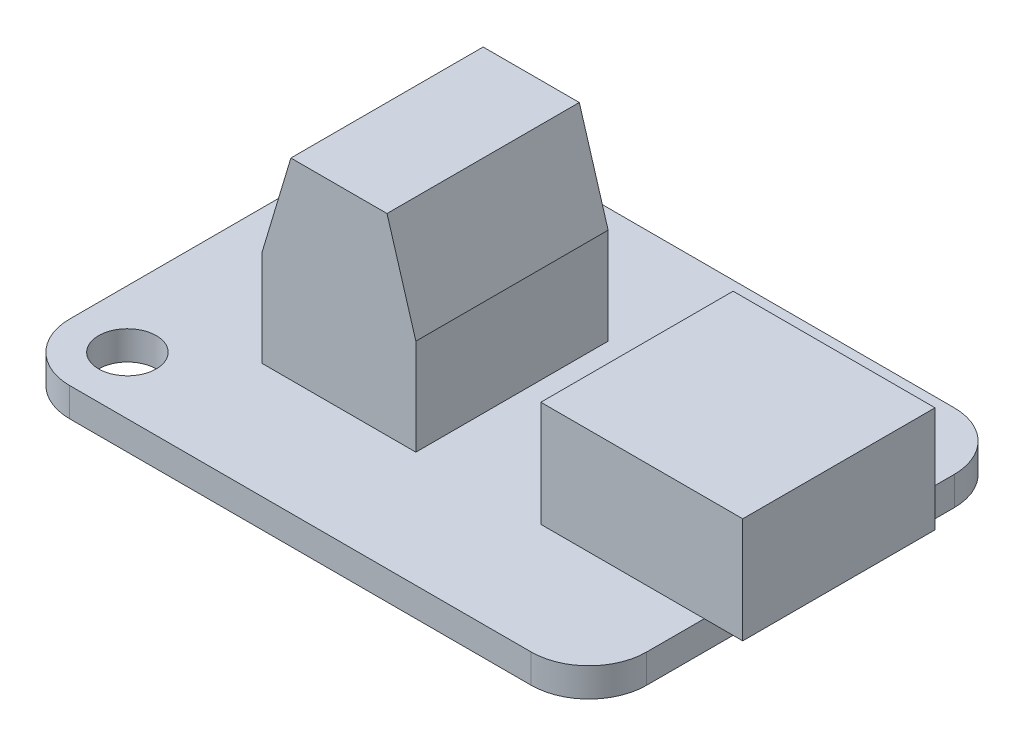
ISO-10303-21;
HEADER;
FILE_DESCRIPTION(('STEP AP214'),'2;1');
FILE_NAME('part.step','',(''),(''),'','','');
FILE_SCHEMA(('AUTOMOTIVE_DESIGN { 1 0 10303 214 1 1 1 1 }'));
ENDSEC;
DATA;
#1=APPLICATION_CONTEXT('core data for automotive mechanical design processes');
#2=APPLICATION_PROTOCOL_DEFINITION('international standard','automotive_design',2000,#1);
#3=PRODUCT_CONTEXT('',#1,'mechanical');
#4=PRODUCT('Part','Part','',(#3));
#5=PRODUCT_RELATED_PRODUCT_CATEGORY('part','',(#4));
#6=PRODUCT_DEFINITION_FORMATION('','',#4);
#7=PRODUCT_DEFINITION_CONTEXT('part definition',#1,'design');
#8=PRODUCT_DEFINITION('design','',#6,#7);
#9=PRODUCT_DEFINITION_SHAPE('','',#8);
#10=(LENGTH_UNIT() NAMED_UNIT(*) SI_UNIT(.MILLI.,.METRE.));
#11=(NAMED_UNIT(*) PLANE_ANGLE_UNIT() SI_UNIT($,.RADIAN.));
#12=(NAMED_UNIT(*) SI_UNIT($,.STERADIAN.) SOLID_ANGLE_UNIT());
#13=UNCERTAINTY_MEASURE_WITH_UNIT(LENGTH_MEASURE(1.E-05),#10,'distance_accuracy_value','');
#14=(GEOMETRIC_REPRESENTATION_CONTEXT(3) GLOBAL_UNCERTAINTY_ASSIGNED_CONTEXT((#13)) GLOBAL_UNIT_ASSIGNED_CONTEXT((#10,
#11,#12)) REPRESENTATION_CONTEXT('',''));
#15=CARTESIAN_POINT('',(0.,0.,0.));
#16=DIRECTION('',(0.,0.,1.));
#17=DIRECTION('',(1.,0.,0.));
#18=AXIS2_PLACEMENT_3D('',#15,#16,#17);
#19=CARTESIAN_POINT('',(-1.19831368631368,1.5,13.1654125874126));
#20=DIRECTION('',(0.,-1.,0.));
#21=DIRECTION('',(0.,0.,-1.));
#22=AXIS2_PLACEMENT_3D('',#19,#20,#21);
#23=PLANE('',#22);
#24=DIRECTION('',(-1.,0.,0.));
#25=VECTOR('',#24,1.);
#26=CARTESIAN_POINT('',(1.80168631368632,1.5,0.165412587412595));
#27=LINE('',#26,#25);
#28=CARTESIAN_POINT('',(1.80168631368632,1.5,0.165412587412596));
#29=VERTEX_POINT('',#28);
#30=CARTESIAN_POINT('',(-6.69831368631368,1.5,0.165412587412596));
#31=VERTEX_POINT('',#30);
#32=EDGE_CURVE('E11',#29,#31,#27,.T.);
#33=ORIENTED_EDGE('',*,*,#32,.F.);
#34=DIRECTION('',(0.,0.,-1.));
#35=VECTOR('',#34,1.);
#36=CARTESIAN_POINT('',(1.80168631368632,1.5,-2.83458741258738));
#37=LINE('',#36,#35);
#38=CARTESIAN_POINT('',(1.80168631368632,1.5,-2.83458741258738));
#39=VERTEX_POINT('',#38);
#40=EDGE_CURVE('E259',#29,#39,#37,.T.);
#41=ORIENTED_EDGE('',*,*,#40,.T.);
#42=CARTESIAN_POINT('',(-1.19831368631368,1.5,-2.8345874125874));
#43=DIRECTION('',(0.,1.,0.));
#44=DIRECTION('',(0.,0.,1.));
#45=AXIS2_PLACEMENT_3D('',#42,#43,#44);
#46=CIRCLE('',#45,3.);
#47=CARTESIAN_POINT('',(-1.1983136863137,1.5,-5.8345874125874));
#48=VERTEX_POINT('',#47);
#49=EDGE_CURVE('E264',#39,#48,#46,.T.);
#50=ORIENTED_EDGE('',*,*,#49,.T.);
#51=DIRECTION('',(-1.,0.,0.));
#52=VECTOR('',#51,1.);
#53=CARTESIAN_POINT('',(-25.1983136863137,1.5,-5.8345874125874));
#54=LINE('',#53,#52);
#55=CARTESIAN_POINT('',(-25.1983136863137,1.5,-5.8345874125874));
#56=VERTEX_POINT('',#55);
#57=EDGE_CURVE('E267',#48,#56,#54,.T.);
#58=ORIENTED_EDGE('',*,*,#57,.T.);
#59=CARTESIAN_POINT('',(-25.1983136863137,1.5,-2.8345874125874));
#60=DIRECTION('',(0.,1.,0.));
#61=DIRECTION('',(0.,0.,1.));
#62=AXIS2_PLACEMENT_3D('',#59,#60,#61);
#63=CIRCLE('',#62,3.);
#64=CARTESIAN_POINT('',(-28.1983136863137,1.5,-2.83458741258738));
#65=VERTEX_POINT('',#64);
#66=EDGE_CURVE('E269',#56,#65,#63,.T.);
#67=ORIENTED_EDGE('',*,*,#66,.T.);
#68=DIRECTION('',(0.,0.,1.));
#69=VECTOR('',#68,1.);
#70=CARTESIAN_POINT('',(-28.1983136863137,1.5,-2.83458741258738));
#71=LINE('',#70,#69);
#72=CARTESIAN_POINT('',(-28.1983136863137,1.5,13.1654125874126));
#73=VERTEX_POINT('',#72);
#74=EDGE_CURVE('E271',#65,#73,#71,.T.);
#75=ORIENTED_EDGE('',*,*,#74,.T.);
#76=CARTESIAN_POINT('',(-25.1983136863137,1.5,13.1654125874126));
#77=DIRECTION('',(0.,1.,0.));
#78=DIRECTION('',(0.,0.,-1.));
#79=AXIS2_PLACEMENT_3D('',#76,#77,#78);
#80=CIRCLE('',#79,3.);
#81=CARTESIAN_POINT('',(-25.1983136863137,1.5,16.1654125874126));
#82=VERTEX_POINT('',#81);
#83=EDGE_CURVE('E273',#73,#82,#80,.T.);
#84=ORIENTED_EDGE('',*,*,#83,.T.);
#85=DIRECTION('',(1.,0.,0.));
#86=VECTOR('',#85,1.);
#87=CARTESIAN_POINT('',(-1.1983136863137,1.5,16.1654125874126));
#88=LINE('',#87,#86);
#89=CARTESIAN_POINT('',(-1.1983136863137,1.5,16.1654125874126));
#90=VERTEX_POINT('',#89);
#91=EDGE_CURVE('E275',#82,#90,#88,.T.);
#92=ORIENTED_EDGE('',*,*,#91,.T.);
#93=CARTESIAN_POINT('',(-1.19831368631368,1.5,13.1654125874126));
#94=DIRECTION('',(0.,1.,0.));
#95=DIRECTION('',(0.,0.,-1.));
#96=AXIS2_PLACEMENT_3D('',#93,#94,#95);
#97=CIRCLE('',#96,3.);
#98=CARTESIAN_POINT('',(1.80168631368632,1.5,13.1654125874126));
#99=VERTEX_POINT('',#98);
#100=EDGE_CURVE('E256',#90,#99,#97,.T.);
#101=ORIENTED_EDGE('',*,*,#100,.T.);
#102=CARTESIAN_POINT('',(1.80168631368632,1.5,10.1654125874126));
#103=VERTEX_POINT('',#102);
#104=EDGE_CURVE('E261',#99,#103,#37,.T.);
#105=ORIENTED_EDGE('',*,*,#104,.T.);
#106=DIRECTION('',(1.,0.,0.));
#107=VECTOR('',#106,1.);
#108=CARTESIAN_POINT('',(1.80168631368632,1.5,10.1654125874126));
#109=LINE('',#108,#107);
#110=CARTESIAN_POINT('',(-6.69831368631368,1.5,10.1654125874126));
#111=VERTEX_POINT('',#110);
#112=EDGE_CURVE('E227',#111,#103,#109,.T.);
#113=ORIENTED_EDGE('',*,*,#112,.F.);
#114=DIRECTION('',(0.,0.,1.));
#115=VECTOR('',#114,1.);
#116=CARTESIAN_POINT('',(-6.69831368631368,1.5,0.165412587412596));
#117=LINE('',#116,#115);
#118=EDGE_CURVE('E223',#31,#111,#117,.T.);
#119=ORIENTED_EDGE('',*,*,#118,.F.);
#120=EDGE_LOOP('',(#33,#41,#50,#58,#67,#75,#84,#92,#101,#105,#113,#119));
#121=FACE_BOUND('',#120,.T.);
#122=CARTESIAN_POINT('',(-25.1983136863137,1.5,13.1654125874126));
#123=DIRECTION('',(0.,1.,0.));
#124=DIRECTION('',(0.,0.,1.));
#125=AXIS2_PLACEMENT_3D('',#122,#123,#124);
#126=CIRCLE('',#125,1.5);
#127=CARTESIAN_POINT('',(-25.1983136863137,1.5,14.6654125874126));
#128=VERTEX_POINT('',#127);
#129=EDGE_CURVE('E250',#128,#128,#126,.T.);
#130=ORIENTED_EDGE('',*,*,#129,.F.);
#131=EDGE_LOOP('',(#130));
#132=FACE_BOUND('',#131,.T.);
#133=CARTESIAN_POINT('',(-25.1983136863137,1.5,-2.8345874125874));
#134=DIRECTION('',(0.,1.,0.));
#135=DIRECTION('',(0.,0.,1.));
#136=AXIS2_PLACEMENT_3D('',#133,#134,#135);
#137=CIRCLE('',#136,1.5);
#138=CARTESIAN_POINT('',(-25.1983136863137,1.5,-1.3345874125874));
#139=VERTEX_POINT('',#138);
#140=EDGE_CURVE('E244',#139,#139,#137,.T.);
#141=ORIENTED_EDGE('',*,*,#140,.F.);
#142=EDGE_LOOP('',(#141));
#143=FACE_BOUND('',#142,.T.);
#144=DIRECTION('',(-1.,0.,0.));
#145=VECTOR('',#144,1.);
#146=CARTESIAN_POINT('',(-13.1983136863137,1.5,0.165412587412596));
#147=LINE('',#146,#145);
#148=CARTESIAN_POINT('',(-13.1983136863137,1.5,0.165412587412596));
#149=VERTEX_POINT('',#148);
#150=CARTESIAN_POINT('',(-21.1983136863137,1.5,0.165412587412596));
#151=VERTEX_POINT('',#150);
#152=EDGE_CURVE('E200',#149,#151,#147,.T.);
#153=ORIENTED_EDGE('',*,*,#152,.F.);
#154=DIRECTION('',(0.,0.,-1.));
#155=VECTOR('',#154,1.);
#156=CARTESIAN_POINT('',(-13.1983136863137,1.5,10.1654125874126));
#157=LINE('',#156,#155);
#158=CARTESIAN_POINT('',(-13.1983136863137,1.5,10.1654125874126));
#159=VERTEX_POINT('',#158);
#160=EDGE_CURVE('E176',#159,#149,#157,.T.);
#161=ORIENTED_EDGE('',*,*,#160,.F.);
#162=DIRECTION('',(1.,0.,0.));
#163=VECTOR('',#162,1.);
#164=CARTESIAN_POINT('',(-21.1983136863137,1.5,10.1654125874126));
#165=LINE('',#164,#163);
#166=CARTESIAN_POINT('',(-21.1983136863137,1.5,10.1654125874126));
#167=VERTEX_POINT('',#166);
#168=EDGE_CURVE('E59',#167,#159,#165,.T.);
#169=ORIENTED_EDGE('',*,*,#168,.F.);
#170=DIRECTION('',(0.,0.,1.));
#171=VECTOR('',#170,1.);
#172=CARTESIAN_POINT('',(-21.1983136863137,1.5,0.165412587412596));
#173=LINE('',#172,#171);
#174=EDGE_CURVE('E54',#151,#167,#173,.T.);
#175=ORIENTED_EDGE('',*,*,#174,.F.);
#176=EDGE_LOOP('',(#153,#161,#169,#175));
#177=FACE_BOUND('',#176,.T.);
#178=ADVANCED_FACE('F37',(#121,#132,#143,#177),#23,.F.);
#179=CARTESIAN_POINT('',(-1.19831368631368,0.,13.1654125874126));
#180=DIRECTION('',(0.,-1.,0.));
#181=DIRECTION('',(0.,0.,-1.));
#182=AXIS2_PLACEMENT_3D('',#179,#180,#181);
#183=PLANE('',#182);
#184=CARTESIAN_POINT('',(-25.1983136863137,0.,13.1654125874126));
#185=DIRECTION('',(0.,1.,0.));
#186=DIRECTION('',(0.,0.,1.));
#187=AXIS2_PLACEMENT_3D('',#184,#185,#186);
#188=CIRCLE('',#187,1.5);
#189=CARTESIAN_POINT('',(-25.1983136863137,0.,14.6654125874126));
#190=VERTEX_POINT('',#189);
#191=EDGE_CURVE('E247',#190,#190,#188,.T.);
#192=ORIENTED_EDGE('',*,*,#191,.T.);
#193=EDGE_LOOP('',(#192));
#194=FACE_BOUND('',#193,.T.);
#195=CARTESIAN_POINT('',(-1.19831368631368,0.,13.1654125874126));
#196=DIRECTION('',(0.,1.,0.));
#197=DIRECTION('',(0.,0.,-1.));
#198=AXIS2_PLACEMENT_3D('',#195,#196,#197);
#199=CIRCLE('',#198,3.);
#200=CARTESIAN_POINT('',(-1.1983136863137,0.,16.1654125874126));
#201=VERTEX_POINT('',#200);
#202=CARTESIAN_POINT('',(1.80168631368632,0.,13.1654125874126));
#203=VERTEX_POINT('',#202);
#204=EDGE_CURVE('E253',#201,#203,#199,.T.);
#205=ORIENTED_EDGE('',*,*,#204,.F.);
#206=DIRECTION('',(1.,0.,0.));
#207=VECTOR('',#206,1.);
#208=CARTESIAN_POINT('',(-1.1983136863137,0.,16.1654125874126));
#209=LINE('',#208,#207);
#210=CARTESIAN_POINT('',(-25.1983136863137,0.,16.1654125874126));
#211=VERTEX_POINT('',#210);
#212=EDGE_CURVE('E260',#211,#201,#209,.T.);
#213=ORIENTED_EDGE('',*,*,#212,.F.);
#214=CARTESIAN_POINT('',(-25.1983136863137,0.,13.1654125874126));
#215=DIRECTION('',(0.,1.,0.));
#216=DIRECTION('',(0.,0.,-1.));
#217=AXIS2_PLACEMENT_3D('',#214,#215,#216);
#218=CIRCLE('',#217,3.);
#219=CARTESIAN_POINT('',(-28.1983136863137,0.,13.1654125874126));
#220=VERTEX_POINT('',#219);
#221=EDGE_CURVE('E290',#220,#211,#218,.T.);
#222=ORIENTED_EDGE('',*,*,#221,.F.);
#223=DIRECTION('',(0.,0.,1.));
#224=VECTOR('',#223,1.);
#225=CARTESIAN_POINT('',(-28.1983136863137,0.,-2.83458741258738));
#226=LINE('',#225,#224);
#227=CARTESIAN_POINT('',(-28.1983136863137,0.,-2.83458741258738));
#228=VERTEX_POINT('',#227);
#229=EDGE_CURVE('E288',#228,#220,#226,.T.);
#230=ORIENTED_EDGE('',*,*,#229,.F.);
#231=CARTESIAN_POINT('',(-25.1983136863137,0.,-2.8345874125874));
#232=DIRECTION('',(0.,1.,0.));
#233=DIRECTION('',(0.,0.,1.));
#234=AXIS2_PLACEMENT_3D('',#231,#232,#233);
#235=CIRCLE('',#234,3.);
#236=CARTESIAN_POINT('',(-25.1983136863137,0.,-5.8345874125874));
#237=VERTEX_POINT('',#236);
#238=EDGE_CURVE('E286',#237,#228,#235,.T.);
#239=ORIENTED_EDGE('',*,*,#238,.F.);
#240=DIRECTION('',(-1.,0.,0.));
#241=VECTOR('',#240,1.);
#242=CARTESIAN_POINT('',(-25.1983136863137,0.,-5.8345874125874));
#243=LINE('',#242,#241);
#244=CARTESIAN_POINT('',(-1.1983136863137,0.,-5.8345874125874));
#245=VERTEX_POINT('',#244);
#246=EDGE_CURVE('E284',#245,#237,#243,.T.);
#247=ORIENTED_EDGE('',*,*,#246,.F.);
#248=CARTESIAN_POINT('',(-1.19831368631368,0.,-2.8345874125874));
#249=DIRECTION('',(0.,1.,0.));
#250=DIRECTION('',(0.,0.,1.));
#251=AXIS2_PLACEMENT_3D('',#248,#249,#250);
#252=CIRCLE('',#251,3.);
#253=CARTESIAN_POINT('',(1.80168631368632,0.,-2.83458741258738));
#254=VERTEX_POINT('',#253);
#255=EDGE_CURVE('E282',#254,#245,#252,.T.);
#256=ORIENTED_EDGE('',*,*,#255,.F.);
#257=DIRECTION('',(0.,0.,-1.));
#258=VECTOR('',#257,1.);
#259=CARTESIAN_POINT('',(1.80168631368632,0.,-2.83458741258738));
#260=LINE('',#259,#258);
#261=EDGE_CURVE('E280',#203,#254,#260,.T.);
#262=ORIENTED_EDGE('',*,*,#261,.F.);
#263=EDGE_LOOP('',(#205,#213,#222,#230,#239,#247,#256,#262));
#264=FACE_BOUND('',#263,.T.);
#265=CARTESIAN_POINT('',(-25.1983136863137,0.,-2.8345874125874));
#266=DIRECTION('',(0.,1.,0.));
#267=DIRECTION('',(0.,0.,1.));
#268=AXIS2_PLACEMENT_3D('',#265,#266,#267);
#269=CIRCLE('',#268,1.5);
#270=CARTESIAN_POINT('',(-25.1983136863137,0.,-1.3345874125874));
#271=VERTEX_POINT('',#270);
#272=EDGE_CURVE('E243',#271,#271,#269,.T.);
#273=ORIENTED_EDGE('',*,*,#272,.T.);
#274=EDGE_LOOP('',(#273));
#275=FACE_BOUND('',#274,.T.);
#276=ADVANCED_FACE('F325',(#194,#264,#275),#183,.T.);
#277=CARTESIAN_POINT('',(-1.19831368631368,1.5,13.1654125874126));
#278=DIRECTION('',(0.,-1.,0.));
#279=DIRECTION('',(0.,0.,-1.));
#280=AXIS2_PLACEMENT_3D('',#277,#278,#279);
#281=CYLINDRICAL_SURFACE('',#280,3.);
#282=ORIENTED_EDGE('',*,*,#204,.T.);
#283=DIRECTION('',(0.,-1.,0.));
#284=VECTOR('',#283,1.);
#285=CARTESIAN_POINT('',(1.80168631368632,1.5,13.1654125874126));
#286=LINE('',#285,#284);
#287=EDGE_CURVE('E41',#99,#203,#286,.T.);
#288=ORIENTED_EDGE('',*,*,#287,.F.);
#289=ORIENTED_EDGE('',*,*,#100,.F.);
#290=DIRECTION('',(0.,-1.,0.));
#291=VECTOR('',#290,1.);
#292=CARTESIAN_POINT('',(-1.1983136863137,1.5,16.1654125874126));
#293=LINE('',#292,#291);
#294=EDGE_CURVE('E277',#90,#201,#293,.T.);
#295=ORIENTED_EDGE('',*,*,#294,.T.);
#296=EDGE_LOOP('',(#282,#288,#289,#295));
#297=FACE_BOUND('',#296,.T.);
#298=ADVANCED_FACE('F39',(#297),#281,.T.);
#299=CARTESIAN_POINT('',(1.80168631368632,1.5,-2.83458741258738));
#300=DIRECTION('',(-1.,0.,0.));
#301=DIRECTION('',(0.,0.,1.));
#302=AXIS2_PLACEMENT_3D('',#299,#300,#301);
#303=PLANE('',#302);
#304=ORIENTED_EDGE('',*,*,#261,.T.);
#305=DIRECTION('',(0.,-1.,0.));
#306=VECTOR('',#305,1.);
#307=CARTESIAN_POINT('',(1.80168631368632,1.5,-2.83458741258738));
#308=LINE('',#307,#306);
#309=EDGE_CURVE('E309',#39,#254,#308,.T.);
#310=ORIENTED_EDGE('',*,*,#309,.F.);
#311=ORIENTED_EDGE('',*,*,#40,.F.);
#312=EDGE_CURVE('E265',#103,#29,#37,.T.);
#313=ORIENTED_EDGE('',*,*,#312,.F.);
#314=ORIENTED_EDGE('',*,*,#104,.F.);
#315=ORIENTED_EDGE('',*,*,#287,.T.);
#316=EDGE_LOOP('',(#304,#310,#311,#313,#314,#315));
#317=FACE_BOUND('',#316,.T.);
#318=ADVANCED_FACE('F318',(#317),#303,.F.);
#319=CARTESIAN_POINT('',(-1.19831368631368,1.5,-2.8345874125874));
#320=DIRECTION('',(0.,-1.,0.));
#321=DIRECTION('',(0.,0.,-1.));
#322=AXIS2_PLACEMENT_3D('',#319,#320,#321);
#323=CYLINDRICAL_SURFACE('',#322,3.);
#324=ORIENTED_EDGE('',*,*,#255,.T.);
#325=DIRECTION('',(0.,-1.,0.));
#326=VECTOR('',#325,1.);
#327=CARTESIAN_POINT('',(-1.1983136863137,1.5,-5.8345874125874));
#328=LINE('',#327,#326);
#329=EDGE_CURVE('E307',#48,#245,#328,.T.);
#330=ORIENTED_EDGE('',*,*,#329,.F.);
#331=ORIENTED_EDGE('',*,*,#49,.F.);
#332=ORIENTED_EDGE('',*,*,#309,.T.);
#333=EDGE_LOOP('',(#324,#330,#331,#332));
#334=FACE_BOUND('',#333,.T.);
#335=ADVANCED_FACE('F331',(#334),#323,.T.);
#336=CARTESIAN_POINT('',(-25.1983136863137,1.5,-5.8345874125874));
#337=DIRECTION('',(0.,0.,1.));
#338=DIRECTION('',(1.,0.,0.));
#339=AXIS2_PLACEMENT_3D('',#336,#337,#338);
#340=PLANE('',#339);
#341=ORIENTED_EDGE('',*,*,#246,.T.);
#342=DIRECTION('',(0.,-1.,0.));
#343=VECTOR('',#342,1.);
#344=CARTESIAN_POINT('',(-25.1983136863137,1.5,-5.8345874125874));
#345=LINE('',#344,#343);
#346=EDGE_CURVE('E304',#56,#237,#345,.T.);
#347=ORIENTED_EDGE('',*,*,#346,.F.);
#348=ORIENTED_EDGE('',*,*,#57,.F.);
#349=ORIENTED_EDGE('',*,*,#329,.T.);
#350=EDGE_LOOP('',(#341,#347,#348,#349));
#351=FACE_BOUND('',#350,.T.);
#352=ADVANCED_FACE('F334',(#351),#340,.F.);
#353=CARTESIAN_POINT('',(-25.1983136863137,1.5,-2.8345874125874));
#354=DIRECTION('',(0.,-1.,0.));
#355=DIRECTION('',(0.,0.,-1.));
#356=AXIS2_PLACEMENT_3D('',#353,#354,#355);
#357=CYLINDRICAL_SURFACE('',#356,3.);
#358=ORIENTED_EDGE('',*,*,#238,.T.);
#359=DIRECTION('',(0.,-1.,0.));
#360=VECTOR('',#359,1.);
#361=CARTESIAN_POINT('',(-28.1983136863137,1.5,-2.83458741258738));
#362=LINE('',#361,#360);
#363=EDGE_CURVE('E301',#65,#228,#362,.T.);
#364=ORIENTED_EDGE('',*,*,#363,.F.);
#365=ORIENTED_EDGE('',*,*,#66,.F.);
#366=ORIENTED_EDGE('',*,*,#346,.T.);
#367=EDGE_LOOP('',(#358,#364,#365,#366));
#368=FACE_BOUND('',#367,.T.);
#369=ADVANCED_FACE('F396',(#368),#357,.T.);
#370=CARTESIAN_POINT('',(-28.1983136863137,1.5,-2.83458741258738));
#371=DIRECTION('',(1.,0.,0.));
#372=DIRECTION('',(0.,0.,-1.));
#373=AXIS2_PLACEMENT_3D('',#370,#371,#372);
#374=PLANE('',#373);
#375=ORIENTED_EDGE('',*,*,#229,.T.);
#376=DIRECTION('',(0.,-1.,0.));
#377=VECTOR('',#376,1.);
#378=CARTESIAN_POINT('',(-28.1983136863137,1.5,13.1654125874126));
#379=LINE('',#378,#377);
#380=EDGE_CURVE('E298',#73,#220,#379,.T.);
#381=ORIENTED_EDGE('',*,*,#380,.F.);
#382=ORIENTED_EDGE('',*,*,#74,.F.);
#383=ORIENTED_EDGE('',*,*,#363,.T.);
#384=EDGE_LOOP('',(#375,#381,#382,#383));
#385=FACE_BOUND('',#384,.T.);
#386=ADVANCED_FACE('F392',(#385),#374,.F.);
#387=CARTESIAN_POINT('',(-25.1983136863137,1.5,13.1654125874126));
#388=DIRECTION('',(0.,-1.,0.));
#389=DIRECTION('',(0.,0.,-1.));
#390=AXIS2_PLACEMENT_3D('',#387,#388,#389);
#391=CYLINDRICAL_SURFACE('',#390,3.);
#392=ORIENTED_EDGE('',*,*,#221,.T.);
#393=DIRECTION('',(0.,-1.,0.));
#394=VECTOR('',#393,1.);
#395=CARTESIAN_POINT('',(-25.1983136863137,1.5,16.1654125874126));
#396=LINE('',#395,#394);
#397=EDGE_CURVE('E295',#82,#211,#396,.T.);
#398=ORIENTED_EDGE('',*,*,#397,.F.);
#399=ORIENTED_EDGE('',*,*,#83,.F.);
#400=ORIENTED_EDGE('',*,*,#380,.T.);
#401=EDGE_LOOP('',(#392,#398,#399,#400));
#402=FACE_BOUND('',#401,.T.);
#403=ADVANCED_FACE('F388',(#402),#391,.T.);
#404=CARTESIAN_POINT('',(-1.1983136863137,1.5,16.1654125874126));
#405=DIRECTION('',(0.,0.,-1.));
#406=DIRECTION('',(-1.,0.,0.));
#407=AXIS2_PLACEMENT_3D('',#404,#405,#406);
#408=PLANE('',#407);
#409=ORIENTED_EDGE('',*,*,#212,.T.);
#410=ORIENTED_EDGE('',*,*,#294,.F.);
#411=ORIENTED_EDGE('',*,*,#91,.F.);
#412=ORIENTED_EDGE('',*,*,#397,.T.);
#413=EDGE_LOOP('',(#409,#410,#411,#412));
#414=FACE_BOUND('',#413,.T.);
#415=ADVANCED_FACE('F385',(#414),#408,.F.);
#416=CARTESIAN_POINT('',(-25.1983136863137,1.5,13.1654125874126));
#417=DIRECTION('',(0.,-1.,0.));
#418=DIRECTION('',(0.,0.,-1.));
#419=AXIS2_PLACEMENT_3D('',#416,#417,#418);
#420=CYLINDRICAL_SURFACE('',#419,1.5);
#421=ORIENTED_EDGE('',*,*,#129,.T.);
#422=EDGE_LOOP('',(#421));
#423=FACE_BOUND('',#422,.T.);
#424=ORIENTED_EDGE('',*,*,#191,.F.);
#425=EDGE_LOOP('',(#424));
#426=FACE_BOUND('',#425,.T.);
#427=ADVANCED_FACE('F382',(#423,#426),#420,.F.);
#428=CARTESIAN_POINT('',(-25.1983136863137,1.5,-2.8345874125874));
#429=DIRECTION('',(0.,-1.,0.));
#430=DIRECTION('',(0.,0.,-1.));
#431=AXIS2_PLACEMENT_3D('',#428,#429,#430);
#432=CYLINDRICAL_SURFACE('',#431,1.5);
#433=ORIENTED_EDGE('',*,*,#140,.T.);
#434=EDGE_LOOP('',(#433));
#435=FACE_BOUND('',#434,.T.);
#436=ORIENTED_EDGE('',*,*,#272,.F.);
#437=EDGE_LOOP('',(#436));
#438=FACE_BOUND('',#437,.T.);
#439=ADVANCED_FACE('F462',(#435,#438),#432,.F.);
#440=CARTESIAN_POINT('',(0.,1.5,0.));
#441=DIRECTION('',(0.,1.,0.));
#442=DIRECTION('',(0.,0.,1.));
#443=AXIS2_PLACEMENT_3D('',#440,#441,#442);
#444=PLANE('',#443);
#445=CARTESIAN_POINT('',(3.80168631368632,1.5,10.1654125874126));
#446=VERTEX_POINT('',#445);
#447=EDGE_CURVE('E226',#103,#446,#109,.T.);
#448=ORIENTED_EDGE('',*,*,#447,.F.);
#449=ORIENTED_EDGE('',*,*,#312,.T.);
#450=CARTESIAN_POINT('',(3.80168631368632,1.5,0.165412587412595));
#451=VERTEX_POINT('',#450);
#452=EDGE_CURVE('E47',#451,#29,#27,.T.);
#453=ORIENTED_EDGE('',*,*,#452,.F.);
#454=DIRECTION('',(0.,0.,-1.));
#455=VECTOR('',#454,1.);
#456=CARTESIAN_POINT('',(3.80168631368632,1.5,10.1654125874126));
#457=LINE('',#456,#455);
#458=EDGE_CURVE('E215',#446,#451,#457,.T.);
#459=ORIENTED_EDGE('',*,*,#458,.F.);
#460=EDGE_LOOP('',(#448,#449,#453,#459));
#461=FACE_BOUND('',#460,.T.);
#462=ADVANCED_FACE('F344',(#461),#444,.F.);
#463=CARTESIAN_POINT('',(1.80168631368632,7.,0.165412587412595));
#464=DIRECTION('',(0.,0.,1.));
#465=DIRECTION('',(1.,0.,0.));
#466=AXIS2_PLACEMENT_3D('',#463,#464,#465);
#467=PLANE('',#466);
#468=ORIENTED_EDGE('',*,*,#452,.T.);
#469=ORIENTED_EDGE('',*,*,#32,.T.);
#470=DIRECTION('',(0.,-1.,0.));
#471=VECTOR('',#470,1.);
#472=CARTESIAN_POINT('',(-6.69831368631368,7.,0.165412587412596));
#473=LINE('',#472,#471);
#474=CARTESIAN_POINT('',(-6.69831368631368,7.,0.165412587412596));
#475=VERTEX_POINT('',#474);
#476=EDGE_CURVE('E240',#475,#31,#473,.T.);
#477=ORIENTED_EDGE('',*,*,#476,.F.);
#478=DIRECTION('',(-1.,0.,0.));
#479=VECTOR('',#478,1.);
#480=CARTESIAN_POINT('',(3.80168631368632,7.,0.165412587412595));
#481=LINE('',#480,#479);
#482=CARTESIAN_POINT('',(3.80168631368632,7.,0.165412587412595));
#483=VERTEX_POINT('',#482);
#484=EDGE_CURVE('E212',#483,#475,#481,.T.);
#485=ORIENTED_EDGE('',*,*,#484,.F.);
#486=DIRECTION('',(0.,-1.,0.));
#487=VECTOR('',#486,1.);
#488=CARTESIAN_POINT('',(3.80168631368632,7.,0.165412587412595));
#489=LINE('',#488,#487);
#490=EDGE_CURVE('E220',#483,#451,#489,.T.);
#491=ORIENTED_EDGE('',*,*,#490,.T.);
#492=EDGE_LOOP('',(#468,#469,#477,#485,#491));
#493=FACE_BOUND('',#492,.T.);
#494=ADVANCED_FACE('F347',(#493),#467,.F.);
#495=CARTESIAN_POINT('',(-6.69831368631368,7.,0.165412587412596));
#496=DIRECTION('',(1.,0.,0.));
#497=DIRECTION('',(0.,0.,-1.));
#498=AXIS2_PLACEMENT_3D('',#495,#496,#497);
#499=PLANE('',#498);
#500=ORIENTED_EDGE('',*,*,#118,.T.);
#501=DIRECTION('',(0.,-1.,0.));
#502=VECTOR('',#501,1.);
#503=CARTESIAN_POINT('',(-6.69831368631368,7.,10.1654125874126));
#504=LINE('',#503,#502);
#505=CARTESIAN_POINT('',(-6.69831368631368,7.,10.1654125874126));
#506=VERTEX_POINT('',#505);
#507=EDGE_CURVE('E237',#506,#111,#504,.T.);
#508=ORIENTED_EDGE('',*,*,#507,.F.);
#509=DIRECTION('',(0.,0.,1.));
#510=VECTOR('',#509,1.);
#511=CARTESIAN_POINT('',(-6.69831368631368,7.,0.165412587412596));
#512=LINE('',#511,#510);
#513=EDGE_CURVE('E214',#475,#506,#512,.T.);
#514=ORIENTED_EDGE('',*,*,#513,.F.);
#515=ORIENTED_EDGE('',*,*,#476,.T.);
#516=EDGE_LOOP('',(#500,#508,#514,#515));
#517=FACE_BOUND('',#516,.T.);
#518=ADVANCED_FACE('F360',(#517),#499,.F.);
#519=CARTESIAN_POINT('',(1.80168631368632,7.,10.1654125874126));
#520=DIRECTION('',(0.,0.,-1.));
#521=DIRECTION('',(-1.,0.,0.));
#522=AXIS2_PLACEMENT_3D('',#519,#520,#521);
#523=PLANE('',#522);
#524=ORIENTED_EDGE('',*,*,#112,.T.);
#525=ORIENTED_EDGE('',*,*,#447,.T.);
#526=DIRECTION('',(0.,-1.,0.));
#527=VECTOR('',#526,1.);
#528=CARTESIAN_POINT('',(3.80168631368632,7.,10.1654125874126));
#529=LINE('',#528,#527);
#530=CARTESIAN_POINT('',(3.80168631368632,7.,10.1654125874126));
#531=VERTEX_POINT('',#530);
#532=EDGE_CURVE('E234',#531,#446,#529,.T.);
#533=ORIENTED_EDGE('',*,*,#532,.F.);
#534=DIRECTION('',(1.,0.,0.));
#535=VECTOR('',#534,1.);
#536=CARTESIAN_POINT('',(1.80168631368632,7.,10.1654125874126));
#537=LINE('',#536,#535);
#538=EDGE_CURVE('E217',#506,#531,#537,.T.);
#539=ORIENTED_EDGE('',*,*,#538,.F.);
#540=ORIENTED_EDGE('',*,*,#507,.T.);
#541=EDGE_LOOP('',(#524,#525,#533,#539,#540));
#542=FACE_BOUND('',#541,.T.);
#543=ADVANCED_FACE('F357',(#542),#523,.F.);
#544=CARTESIAN_POINT('',(3.80168631368632,7.,10.1654125874126));
#545=DIRECTION('',(-1.,0.,0.));
#546=DIRECTION('',(0.,0.,1.));
#547=AXIS2_PLACEMENT_3D('',#544,#545,#546);
#548=PLANE('',#547);
#549=ORIENTED_EDGE('',*,*,#458,.T.);
#550=ORIENTED_EDGE('',*,*,#490,.F.);
#551=DIRECTION('',(0.,0.,-1.));
#552=VECTOR('',#551,1.);
#553=CARTESIAN_POINT('',(3.80168631368632,7.,10.1654125874126));
#554=LINE('',#553,#552);
#555=EDGE_CURVE('E219',#531,#483,#554,.T.);
#556=ORIENTED_EDGE('',*,*,#555,.F.);
#557=ORIENTED_EDGE('',*,*,#532,.T.);
#558=EDGE_LOOP('',(#549,#550,#556,#557));
#559=FACE_BOUND('',#558,.T.);
#560=ADVANCED_FACE('F353',(#559),#548,.F.);
#561=CARTESIAN_POINT('',(0.,7.,0.));
#562=DIRECTION('',(0.,1.,0.));
#563=DIRECTION('',(0.,0.,1.));
#564=AXIS2_PLACEMENT_3D('',#561,#562,#563);
#565=PLANE('',#564);
#566=ORIENTED_EDGE('',*,*,#484,.T.);
#567=ORIENTED_EDGE('',*,*,#513,.T.);
#568=ORIENTED_EDGE('',*,*,#538,.T.);
#569=ORIENTED_EDGE('',*,*,#555,.T.);
#570=EDGE_LOOP('',(#566,#567,#568,#569));
#571=FACE_BOUND('',#570,.T.);
#572=ADVANCED_FACE('F363',(#571),#565,.T.);
#573=CARTESIAN_POINT('',(-13.1983136863137,6.5,0.165412587412596));
#574=DIRECTION('',(0.,0.,1.));
#575=DIRECTION('',(1.,0.,0.));
#576=AXIS2_PLACEMENT_3D('',#573,#574,#575);
#577=PLANE('',#576);
#578=ORIENTED_EDGE('',*,*,#152,.T.);
#579=DIRECTION('',(0.,-1.,0.));
#580=VECTOR('',#579,1.);
#581=CARTESIAN_POINT('',(-21.1983136863137,6.5,0.165412587412596));
#582=LINE('',#581,#580);
#583=CARTESIAN_POINT('',(-21.1983136863137,6.5,0.165412587412596));
#584=VERTEX_POINT('',#583);
#585=EDGE_CURVE('E210',#584,#151,#582,.T.);
#586=ORIENTED_EDGE('',*,*,#585,.F.);
#587=DIRECTION('',(-0.287347885566346,-0.957826285221151,0.));
#588=VECTOR('',#587,1.);
#589=CARTESIAN_POINT('',(-21.2369850333153,6.3710955099946,0.165412587412596));
#590=LINE('',#589,#588);
#591=CARTESIAN_POINT('',(-19.6983136863137,11.5,0.165412587412596));
#592=VERTEX_POINT('',#591);
#593=EDGE_CURVE('E594',#592,#584,#590,.T.);
#594=ORIENTED_EDGE('',*,*,#593,.F.);
#595=DIRECTION('',(-1.,0.,0.));
#596=VECTOR('',#595,1.);
#597=CARTESIAN_POINT('',(0.,11.5,0.165412587412596));
#598=LINE('',#597,#596);
#599=CARTESIAN_POINT('',(-14.6983136863137,11.5,0.165412587412596));
#600=VERTEX_POINT('',#599);
#601=EDGE_CURVE('E187',#600,#592,#598,.T.);
#602=ORIENTED_EDGE('',*,*,#601,.F.);
#603=DIRECTION('',(0.287347885566345,-0.957826285221151,0.));
#604=VECTOR('',#603,1.);
#605=CARTESIAN_POINT('',(-10.3195538406547,-3.09586615219642,0.165412587412596));
#606=LINE('',#605,#604);
#607=CARTESIAN_POINT('',(-13.1983136863137,6.5,0.165412587412596));
#608=VERTEX_POINT('',#607);
#609=EDGE_CURVE('E183',#600,#608,#606,.T.);
#610=ORIENTED_EDGE('',*,*,#609,.T.);
#611=DIRECTION('',(0.,-1.,0.));
#612=VECTOR('',#611,1.);
#613=CARTESIAN_POINT('',(-13.1983136863137,6.5,0.165412587412596));
#614=LINE('',#613,#612);
#615=EDGE_CURVE('E169',#608,#149,#614,.T.);
#616=ORIENTED_EDGE('',*,*,#615,.T.);
#617=EDGE_LOOP('',(#578,#586,#594,#602,#610,#616));
#618=FACE_BOUND('',#617,.T.);
#619=ADVANCED_FACE('F184',(#618),#577,.F.);
#620=CARTESIAN_POINT('',(-21.1983136863137,6.5,0.165412587412596));
#621=DIRECTION('',(1.,0.,0.));
#622=DIRECTION('',(0.,0.,-1.));
#623=AXIS2_PLACEMENT_3D('',#620,#621,#622);
#624=PLANE('',#623);
#625=ORIENTED_EDGE('',*,*,#174,.T.);
#626=DIRECTION('',(0.,-1.,0.));
#627=VECTOR('',#626,1.);
#628=CARTESIAN_POINT('',(-21.1983136863137,6.5,10.1654125874126));
#629=LINE('',#628,#627);
#630=CARTESIAN_POINT('',(-21.1983136863137,6.5,10.1654125874126));
#631=VERTEX_POINT('',#630);
#632=EDGE_CURVE('E207',#631,#167,#629,.T.);
#633=ORIENTED_EDGE('',*,*,#632,.F.);
#634=DIRECTION('',(0.,0.,1.));
#635=VECTOR('',#634,1.);
#636=CARTESIAN_POINT('',(-21.1983136863137,6.5,0.165412587412596));
#637=LINE('',#636,#635);
#638=EDGE_CURVE('E194',#584,#631,#637,.T.);
#639=ORIENTED_EDGE('',*,*,#638,.F.);
#640=ORIENTED_EDGE('',*,*,#585,.T.);
#641=EDGE_LOOP('',(#625,#633,#639,#640));
#642=FACE_BOUND('',#641,.T.);
#643=ADVANCED_FACE('F370',(#642),#624,.F.);
#644=CARTESIAN_POINT('',(-21.1983136863137,6.5,10.1654125874126));
#645=DIRECTION('',(0.,0.,-1.));
#646=DIRECTION('',(-1.,0.,0.));
#647=AXIS2_PLACEMENT_3D('',#644,#645,#646);
#648=PLANE('',#647);
#649=ORIENTED_EDGE('',*,*,#168,.T.);
#650=DIRECTION('',(0.,-1.,0.));
#651=VECTOR('',#650,1.);
#652=CARTESIAN_POINT('',(-13.1983136863137,6.5,10.1654125874126));
#653=LINE('',#652,#651);
#654=CARTESIAN_POINT('',(-13.1983136863137,6.5,10.1654125874126));
#655=VERTEX_POINT('',#654);
#656=EDGE_CURVE('E179',#655,#159,#653,.T.);
#657=ORIENTED_EDGE('',*,*,#656,.F.);
#658=DIRECTION('',(0.287347885566345,-0.957826285221151,0.));
#659=VECTOR('',#658,1.);
#660=CARTESIAN_POINT('',(-10.3195538406547,-3.09586615219642,10.1654125874126));
#661=LINE('',#660,#659);
#662=CARTESIAN_POINT('',(-14.6983136863137,11.5,10.1654125874126));
#663=VERTEX_POINT('',#662);
#664=EDGE_CURVE('E193',#663,#655,#661,.T.);
#665=ORIENTED_EDGE('',*,*,#664,.F.);
#666=DIRECTION('',(-1.,0.,0.));
#667=VECTOR('',#666,1.);
#668=CARTESIAN_POINT('',(0.,11.5,10.1654125874126));
#669=LINE('',#668,#667);
#670=CARTESIAN_POINT('',(-19.6983136863137,11.5,10.1654125874126));
#671=VERTEX_POINT('',#670);
#672=EDGE_CURVE('E585',#663,#671,#669,.T.);
#673=ORIENTED_EDGE('',*,*,#672,.T.);
#674=DIRECTION('',(-0.287347885566346,-0.957826285221151,0.));
#675=VECTOR('',#674,1.);
#676=CARTESIAN_POINT('',(-21.2369850333153,6.3710955099946,10.1654125874126));
#677=LINE('',#676,#675);
#678=EDGE_CURVE('E189',#671,#631,#677,.T.);
#679=ORIENTED_EDGE('',*,*,#678,.T.);
#680=ORIENTED_EDGE('',*,*,#632,.T.);
#681=EDGE_LOOP('',(#649,#657,#665,#673,#679,#680));
#682=FACE_BOUND('',#681,.T.);
#683=ADVANCED_FACE('F530',(#682),#648,.F.);
#684=CARTESIAN_POINT('',(-13.1983136863137,6.5,10.1654125874126));
#685=DIRECTION('',(-1.,0.,0.));
#686=DIRECTION('',(0.,0.,1.));
#687=AXIS2_PLACEMENT_3D('',#684,#685,#686);
#688=PLANE('',#687);
#689=ORIENTED_EDGE('',*,*,#160,.T.);
#690=ORIENTED_EDGE('',*,*,#615,.F.);
#691=DIRECTION('',(0.,0.,-1.));
#692=VECTOR('',#691,1.);
#693=CARTESIAN_POINT('',(-13.1983136863137,6.5,10.1654125874126));
#694=LINE('',#693,#692);
#695=EDGE_CURVE('E174',#655,#608,#694,.T.);
#696=ORIENTED_EDGE('',*,*,#695,.F.);
#697=ORIENTED_EDGE('',*,*,#656,.T.);
#698=EDGE_LOOP('',(#689,#690,#696,#697));
#699=FACE_BOUND('',#698,.T.);
#700=ADVANCED_FACE('F171',(#699),#688,.F.);
#701=CARTESIAN_POINT('',(-21.2369850333153,6.3710955099946,0.165412587412596));
#702=DIRECTION('',(-0.957826285221151,0.287347885566346,0.));
#703=DIRECTION('',(-0.287347885566346,-0.957826285221151,0.));
#704=AXIS2_PLACEMENT_3D('',#701,#702,#703);
#705=PLANE('',#704);
#706=ORIENTED_EDGE('',*,*,#678,.F.);
#707=DIRECTION('',(0.,0.,1.));
#708=VECTOR('',#707,1.);
#709=CARTESIAN_POINT('',(-19.6983136863137,11.5,0.165412587412596));
#710=LINE('',#709,#708);
#711=EDGE_CURVE('E202',#592,#671,#710,.T.);
#712=ORIENTED_EDGE('',*,*,#711,.F.);
#713=ORIENTED_EDGE('',*,*,#593,.T.);
#714=ORIENTED_EDGE('',*,*,#638,.T.);
#715=EDGE_LOOP('',(#706,#712,#713,#714));
#716=FACE_BOUND('',#715,.T.);
#717=ADVANCED_FACE('F548',(#716),#705,.T.);
#718=CARTESIAN_POINT('',(0.,11.5,0.165412587412596));
#719=DIRECTION('',(0.,1.,0.));
#720=DIRECTION('',(0.,0.,1.));
#721=AXIS2_PLACEMENT_3D('',#718,#719,#720);
#722=PLANE('',#721);
#723=ORIENTED_EDGE('',*,*,#672,.F.);
#724=DIRECTION('',(0.,0.,1.));
#725=VECTOR('',#724,1.);
#726=CARTESIAN_POINT('',(-14.6983136863137,11.5,0.165412587412596));
#727=LINE('',#726,#725);
#728=EDGE_CURVE('E586',#600,#663,#727,.T.);
#729=ORIENTED_EDGE('',*,*,#728,.F.);
#730=ORIENTED_EDGE('',*,*,#601,.T.);
#731=ORIENTED_EDGE('',*,*,#711,.T.);
#732=EDGE_LOOP('',(#723,#729,#730,#731));
#733=FACE_BOUND('',#732,.T.);
#734=ADVANCED_FACE('F558',(#733),#722,.T.);
#735=CARTESIAN_POINT('',(-10.3195538406547,-3.09586615219642,0.165412587412596));
#736=DIRECTION('',(-0.957826285221151,-0.287347885566345,0.));
#737=DIRECTION('',(0.287347885566345,-0.957826285221151,0.));
#738=AXIS2_PLACEMENT_3D('',#735,#736,#737);
#739=PLANE('',#738);
#740=ORIENTED_EDGE('',*,*,#664,.T.);
#741=ORIENTED_EDGE('',*,*,#695,.T.);
#742=ORIENTED_EDGE('',*,*,#609,.F.);
#743=ORIENTED_EDGE('',*,*,#728,.T.);
#744=EDGE_LOOP('',(#740,#741,#742,#743));
#745=FACE_BOUND('',#744,.T.);
#746=ADVANCED_FACE('F191',(#745),#739,.F.);
#747=CLOSED_SHELL('',(#178,#276,#298,#318,#335,#352,#369,#386,#403,#415,#427,#439,#462,#494,
#518,#543,#560,#572,#619,#643,#683,#700,#717,#734,#746));
#748=MANIFOLD_SOLID_BREP('B2',#747);
#749=ADVANCED_BREP_SHAPE_REPRESENTATION('',(#18,#748),#14);
#750=SHAPE_DEFINITION_REPRESENTATION(#9,#749);
ENDSEC;
END-ISO-10303-21;
